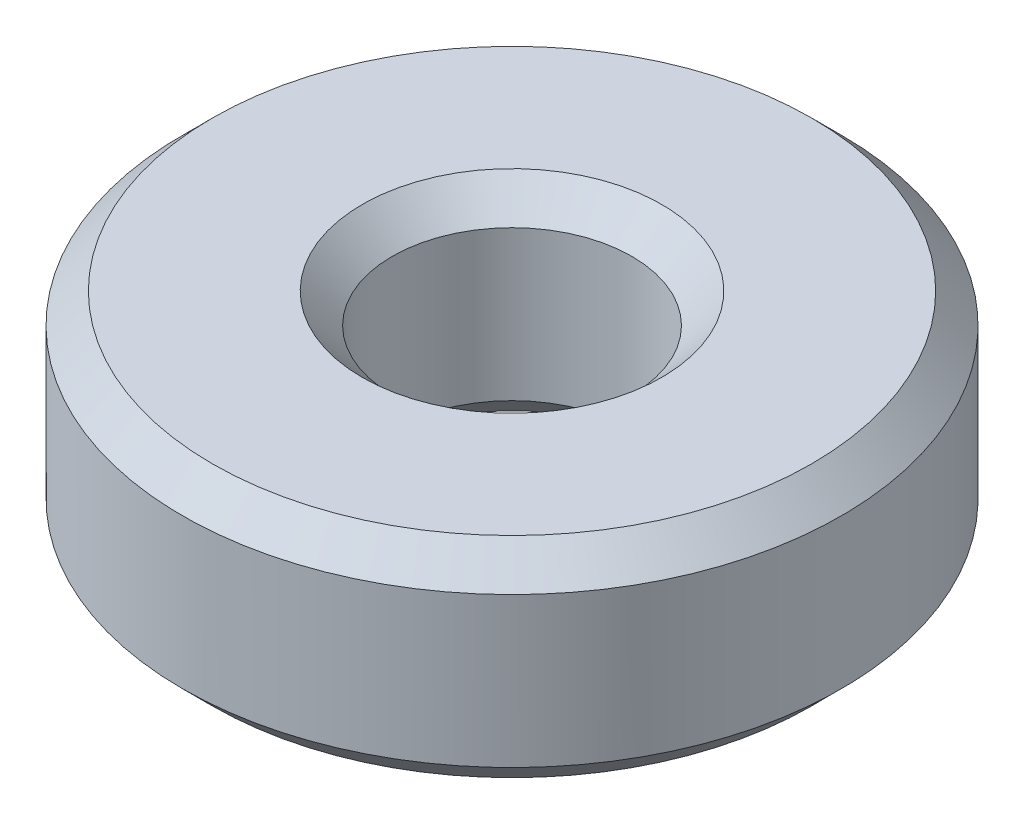
ISO-10303-21;
HEADER;
FILE_DESCRIPTION(('STEP AP214'),'2;1');
FILE_NAME('part.step','',(''),(''),'','','');
FILE_SCHEMA(('AUTOMOTIVE_DESIGN { 1 0 10303 214 1 1 1 1 }'));
ENDSEC;
DATA;
#1=APPLICATION_CONTEXT('core data for automotive mechanical design processes');
#2=APPLICATION_PROTOCOL_DEFINITION('international standard','automotive_design',2000,#1);
#3=PRODUCT_CONTEXT('',#1,'mechanical');
#4=PRODUCT('Part','Part','',(#3));
#5=PRODUCT_RELATED_PRODUCT_CATEGORY('part','',(#4));
#6=PRODUCT_DEFINITION_FORMATION('','',#4);
#7=PRODUCT_DEFINITION_CONTEXT('part definition',#1,'design');
#8=PRODUCT_DEFINITION('design','',#6,#7);
#9=PRODUCT_DEFINITION_SHAPE('','',#8);
#10=(LENGTH_UNIT() NAMED_UNIT(*) SI_UNIT(.MILLI.,.METRE.));
#11=(NAMED_UNIT(*) PLANE_ANGLE_UNIT() SI_UNIT($,.RADIAN.));
#12=(NAMED_UNIT(*) SI_UNIT($,.STERADIAN.) SOLID_ANGLE_UNIT());
#13=UNCERTAINTY_MEASURE_WITH_UNIT(LENGTH_MEASURE(1.E-05),#10,'distance_accuracy_value','');
#14=(GEOMETRIC_REPRESENTATION_CONTEXT(3) GLOBAL_UNCERTAINTY_ASSIGNED_CONTEXT((#13)) GLOBAL_UNIT_ASSIGNED_CONTEXT((#10,
#11,#12)) REPRESENTATION_CONTEXT('',''));
#15=CARTESIAN_POINT('',(0.,0.,0.));
#16=DIRECTION('',(0.,0.,1.));
#17=DIRECTION('',(1.,0.,0.));
#18=AXIS2_PLACEMENT_3D('',#15,#16,#17);
#19=CARTESIAN_POINT('',(0.,0.,0.));
#20=DIRECTION('',(0.,1.,0.));
#21=DIRECTION('',(0.,0.,1.));
#22=AXIS2_PLACEMENT_3D('',#19,#20,#21);
#23=PLANE('',#22);
#24=CARTESIAN_POINT('',(0.,0.,0.));
#25=DIRECTION('',(0.,1.,0.));
#26=DIRECTION('',(0.,0.,1.));
#27=AXIS2_PLACEMENT_3D('',#24,#25,#26);
#28=CIRCLE('',#27,10.);
#29=CARTESIAN_POINT('',(0.,0.,10.));
#30=VERTEX_POINT('',#29);
#31=EDGE_CURVE('E31',#30,#30,#28,.T.);
#32=ORIENTED_EDGE('',*,*,#31,.F.);
#33=EDGE_LOOP('',(#32));
#34=FACE_BOUND('',#33,.T.);
#35=CARTESIAN_POINT('',(0.,0.,0.));
#36=DIRECTION('',(0.,-1.,0.));
#37=DIRECTION('',(0.,0.,-1.));
#38=AXIS2_PLACEMENT_3D('',#35,#36,#37);
#39=CIRCLE('',#38,4.99999999999545);
#40=CARTESIAN_POINT('',(0.,0.,-4.99999999999545));
#41=VERTEX_POINT('',#40);
#42=EDGE_CURVE('E17',#41,#41,#39,.F.);
#43=ORIENTED_EDGE('',*,*,#42,.T.);
#44=EDGE_LOOP('',(#43));
#45=FACE_BOUND('',#44,.T.);
#46=ADVANCED_FACE('F14',(#34,#45),#23,.F.);
#47=CARTESIAN_POINT('',(0.,0.,0.));
#48=DIRECTION('',(0.,-1.,0.));
#49=DIRECTION('',(0.,0.,-1.));
#50=AXIS2_PLACEMENT_3D('',#47,#48,#49);
#51=CONICAL_SURFACE('',#50,4.99999999999545,0.785398163397448);
#52=CARTESIAN_POINT('',(0.,0.999999999999997,0.));
#53=DIRECTION('',(0.,-1.,0.));
#54=DIRECTION('',(0.,0.,-1.));
#55=AXIS2_PLACEMENT_3D('',#52,#53,#54);
#56=CIRCLE('',#55,4.);
#57=CARTESIAN_POINT('',(0.,0.999999999999997,-4.));
#58=VERTEX_POINT('',#57);
#59=EDGE_CURVE('E29',#58,#58,#56,.F.);
#60=ORIENTED_EDGE('',*,*,#59,.T.);
#61=EDGE_LOOP('',(#60));
#62=FACE_BOUND('',#61,.T.);
#63=ORIENTED_EDGE('',*,*,#42,.F.);
#64=EDGE_LOOP('',(#63));
#65=FACE_BOUND('',#64,.T.);
#66=ADVANCED_FACE('F41',(#62,#65),#51,.F.);
#67=CARTESIAN_POINT('',(0.,0.999999999999997,0.));
#68=DIRECTION('',(0.,1.,0.));
#69=DIRECTION('',(0.,0.,1.));
#70=AXIS2_PLACEMENT_3D('',#67,#68,#69);
#71=CONICAL_SURFACE('',#70,11.,0.785398163397451);
#72=CARTESIAN_POINT('',(0.,0.999999999999997,0.));
#73=DIRECTION('',(0.,-1.,0.));
#74=DIRECTION('',(0.,0.,-1.));
#75=AXIS2_PLACEMENT_3D('',#72,#73,#74);
#76=CIRCLE('',#75,11.);
#77=CARTESIAN_POINT('',(0.,0.999999999999997,-11.));
#78=VERTEX_POINT('',#77);
#79=EDGE_CURVE('E36',#78,#78,#76,.F.);
#80=ORIENTED_EDGE('',*,*,#79,.F.);
#81=EDGE_LOOP('',(#80));
#82=FACE_BOUND('',#81,.T.);
#83=ORIENTED_EDGE('',*,*,#31,.T.);
#84=EDGE_LOOP('',(#83));
#85=FACE_BOUND('',#84,.T.);
#86=ADVANCED_FACE('F43',(#82,#85),#71,.T.);
#87=CARTESIAN_POINT('',(0.,7.,0.));
#88=DIRECTION('',(0.,-1.,0.));
#89=DIRECTION('',(0.,0.,-1.));
#90=AXIS2_PLACEMENT_3D('',#87,#88,#89);
#91=CYLINDRICAL_SURFACE('',#90,4.);
#92=CARTESIAN_POINT('',(0.,6.00000000008549,0.));
#93=DIRECTION('',(0.,1.,0.));
#94=DIRECTION('',(0.,0.,1.));
#95=AXIS2_PLACEMENT_3D('',#92,#93,#94);
#96=CIRCLE('',#95,4.0000000000191);
#97=CARTESIAN_POINT('',(0.,6.00000000008549,4.0000000000191));
#98=VERTEX_POINT('',#97);
#99=EDGE_CURVE('E80',#98,#98,#96,.T.);
#100=ORIENTED_EDGE('',*,*,#99,.T.);
#101=EDGE_LOOP('',(#100));
#102=FACE_BOUND('',#101,.T.);
#103=ORIENTED_EDGE('',*,*,#59,.F.);
#104=EDGE_LOOP('',(#103));
#105=FACE_BOUND('',#104,.T.);
#106=ADVANCED_FACE('F50',(#102,#105),#91,.F.);
#107=CARTESIAN_POINT('',(0.,7.,0.));
#108=DIRECTION('',(0.,-1.,0.));
#109=DIRECTION('',(0.,0.,-1.));
#110=AXIS2_PLACEMENT_3D('',#107,#108,#109);
#111=CYLINDRICAL_SURFACE('',#110,11.);
#112=ORIENTED_EDGE('',*,*,#79,.T.);
#113=EDGE_LOOP('',(#112));
#114=FACE_BOUND('',#113,.T.);
#115=CARTESIAN_POINT('',(0.,6.00000000000001,0.));
#116=DIRECTION('',(0.,-1.,0.));
#117=DIRECTION('',(0.,0.,-1.));
#118=AXIS2_PLACEMENT_3D('',#115,#116,#117);
#119=CIRCLE('',#118,11.);
#120=CARTESIAN_POINT('',(0.,6.00000000000001,-11.));
#121=VERTEX_POINT('',#120);
#122=EDGE_CURVE('E26',#121,#121,#119,.F.);
#123=ORIENTED_EDGE('',*,*,#122,.F.);
#124=EDGE_LOOP('',(#123));
#125=FACE_BOUND('',#124,.T.);
#126=ADVANCED_FACE('F68',(#114,#125),#111,.T.);
#127=CARTESIAN_POINT('',(0.,7.000000000005,0.));
#128=DIRECTION('',(0.,1.,0.));
#129=DIRECTION('',(0.,0.,1.));
#130=AXIS2_PLACEMENT_3D('',#127,#128,#129);
#131=CONICAL_SURFACE('',#130,4.99999999993861,0.785398163397448);
#132=ORIENTED_EDGE('',*,*,#99,.F.);
#133=EDGE_LOOP('',(#132));
#134=FACE_BOUND('',#133,.T.);
#135=CARTESIAN_POINT('',(0.,7.000000000005,0.));
#136=DIRECTION('',(0.,1.,0.));
#137=DIRECTION('',(0.,0.,1.));
#138=AXIS2_PLACEMENT_3D('',#135,#136,#137);
#139=CIRCLE('',#138,4.99999999993861);
#140=CARTESIAN_POINT('',(0.,7.000000000005,4.99999999993861));
#141=VERTEX_POINT('',#140);
#142=EDGE_CURVE('E21',#141,#141,#139,.F.);
#143=ORIENTED_EDGE('',*,*,#142,.F.);
#144=EDGE_LOOP('',(#143));
#145=FACE_BOUND('',#144,.T.);
#146=ADVANCED_FACE('F61',(#134,#145),#131,.F.);
#147=CARTESIAN_POINT('',(0.,6.00000000000001,0.));
#148=DIRECTION('',(0.,-1.,0.));
#149=DIRECTION('',(0.,0.,-1.));
#150=AXIS2_PLACEMENT_3D('',#147,#148,#149);
#151=CONICAL_SURFACE('',#150,11.,0.785398163397447);
#152=ORIENTED_EDGE('',*,*,#122,.T.);
#153=EDGE_LOOP('',(#152));
#154=FACE_BOUND('',#153,.T.);
#155=CARTESIAN_POINT('',(0.,7.,0.));
#156=DIRECTION('',(0.,-1.,0.));
#157=DIRECTION('',(0.,0.,-1.));
#158=AXIS2_PLACEMENT_3D('',#155,#156,#157);
#159=CIRCLE('',#158,10.);
#160=CARTESIAN_POINT('',(0.,7.,-10.));
#161=VERTEX_POINT('',#160);
#162=EDGE_CURVE('E10',#161,#161,#159,.F.);
#163=ORIENTED_EDGE('',*,*,#162,.F.);
#164=EDGE_LOOP('',(#163));
#165=FACE_BOUND('',#164,.T.);
#166=ADVANCED_FACE('F56',(#154,#165),#151,.T.);
#167=CARTESIAN_POINT('',(0.,7.,0.));
#168=DIRECTION('',(0.,1.,0.));
#169=DIRECTION('',(0.,0.,1.));
#170=AXIS2_PLACEMENT_3D('',#167,#168,#169);
#171=PLANE('',#170);
#172=ORIENTED_EDGE('',*,*,#162,.T.);
#173=EDGE_LOOP('',(#172));
#174=FACE_BOUND('',#173,.T.);
#175=ORIENTED_EDGE('',*,*,#142,.T.);
#176=EDGE_LOOP('',(#175));
#177=FACE_BOUND('',#176,.T.);
#178=ADVANCED_FACE('F54',(#174,#177),#171,.T.);
#179=CLOSED_SHELL('',(#46,#66,#86,#106,#126,#146,#166,#178));
#180=MANIFOLD_SOLID_BREP('B1',#179);
#181=ADVANCED_BREP_SHAPE_REPRESENTATION('',(#18,#180),#14);
#182=SHAPE_DEFINITION_REPRESENTATION(#9,#181);
ENDSEC;
END-ISO-10303-21;
